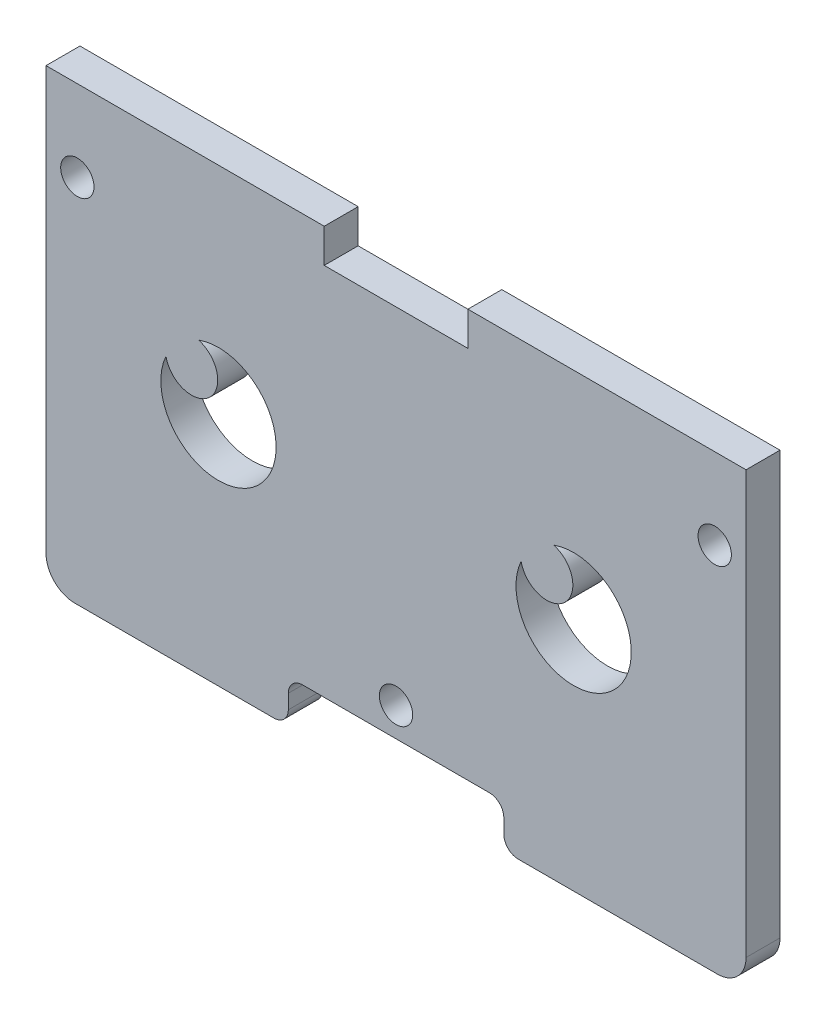
ISO-10303-21;
HEADER;
FILE_DESCRIPTION(('STEP AP214'),'2;1');
FILE_NAME('part.step','',(''),(''),'','','');
FILE_SCHEMA(('AUTOMOTIVE_DESIGN { 1 0 10303 214 1 1 1 1 }'));
ENDSEC;
DATA;
#1=APPLICATION_CONTEXT('core data for automotive mechanical design processes');
#2=APPLICATION_PROTOCOL_DEFINITION('international standard','automotive_design',2000,#1);
#3=PRODUCT_CONTEXT('',#1,'mechanical');
#4=PRODUCT('Part','Part','',(#3));
#5=PRODUCT_RELATED_PRODUCT_CATEGORY('part','',(#4));
#6=PRODUCT_DEFINITION_FORMATION('','',#4);
#7=PRODUCT_DEFINITION_CONTEXT('part definition',#1,'design');
#8=PRODUCT_DEFINITION('design','',#6,#7);
#9=PRODUCT_DEFINITION_SHAPE('','',#8);
#10=(LENGTH_UNIT() NAMED_UNIT(*) SI_UNIT(.MILLI.,.METRE.));
#11=(NAMED_UNIT(*) PLANE_ANGLE_UNIT() SI_UNIT($,.RADIAN.));
#12=(NAMED_UNIT(*) SI_UNIT($,.STERADIAN.) SOLID_ANGLE_UNIT());
#13=UNCERTAINTY_MEASURE_WITH_UNIT(LENGTH_MEASURE(1.E-05),#10,'distance_accuracy_value','');
#14=(GEOMETRIC_REPRESENTATION_CONTEXT(3) GLOBAL_UNCERTAINTY_ASSIGNED_CONTEXT((#13)) GLOBAL_UNIT_ASSIGNED_CONTEXT((#10,
#11,#12)) REPRESENTATION_CONTEXT('',''));
#15=CARTESIAN_POINT('',(0.,0.,0.));
#16=DIRECTION('',(0.,0.,1.));
#17=DIRECTION('',(1.,0.,0.));
#18=AXIS2_PLACEMENT_3D('',#15,#16,#17);
#19=CARTESIAN_POINT('',(0.,0.,3.));
#20=DIRECTION('',(0.,1.,0.));
#21=DIRECTION('',(0.,0.,1.));
#22=AXIS2_PLACEMENT_3D('',#19,#20,#21);
#23=PLANE('',#22);
#24=DIRECTION('',(1.,0.,0.));
#25=VECTOR('',#24,1.);
#26=CARTESIAN_POINT('',(0.,0.,3.));
#27=LINE('',#26,#25);
#28=CARTESIAN_POINT('',(41.7378,0.,3.));
#29=VERTEX_POINT('',#28);
#30=CARTESIAN_POINT('',(59.34,0.,3.));
#31=VERTEX_POINT('',#30);
#32=EDGE_CURVE('E281',#29,#31,#27,.T.);
#33=ORIENTED_EDGE('',*,*,#32,.F.);
#34=DIRECTION('',(0.,0.,-1.));
#35=VECTOR('',#34,1.);
#36=CARTESIAN_POINT('',(41.7378,0.,3.));
#37=LINE('',#36,#35);
#38=CARTESIAN_POINT('',(41.7378,0.,0.));
#39=VERTEX_POINT('',#38);
#40=EDGE_CURVE('E354',#29,#39,#37,.T.);
#41=ORIENTED_EDGE('',*,*,#40,.T.);
#42=DIRECTION('',(1.,0.,0.));
#43=VECTOR('',#42,1.);
#44=CARTESIAN_POINT('',(0.,0.,0.));
#45=LINE('',#44,#43);
#46=CARTESIAN_POINT('',(59.34,0.,0.));
#47=VERTEX_POINT('',#46);
#48=EDGE_CURVE('E295',#39,#47,#45,.T.);
#49=ORIENTED_EDGE('',*,*,#48,.T.);
#50=DIRECTION('',(0.,0.,-1.));
#51=VECTOR('',#50,1.);
#52=CARTESIAN_POINT('',(59.34,0.,3.));
#53=LINE('',#52,#51);
#54=EDGE_CURVE('E309',#47,#31,#53,.F.);
#55=ORIENTED_EDGE('',*,*,#54,.T.);
#56=EDGE_LOOP('',(#33,#41,#49,#55));
#57=FACE_BOUND('',#56,.T.);
#58=ADVANCED_FACE('F34',(#57),#23,.F.);
#59=CARTESIAN_POINT('',(0.,39.878,3.));
#60=DIRECTION('',(0.,-1.,0.));
#61=DIRECTION('',(0.,0.,-1.));
#62=AXIS2_PLACEMENT_3D('',#59,#60,#61);
#63=PLANE('',#62);
#64=DIRECTION('',(-1.,0.,0.));
#65=VECTOR('',#64,1.);
#66=CARTESIAN_POINT('',(0.,39.878,0.));
#67=LINE('',#66,#65);
#68=CARTESIAN_POINT('',(61.88,39.878,0.));
#69=VERTEX_POINT('',#68);
#70=CARTESIAN_POINT('',(37.2928,39.878,0.));
#71=VERTEX_POINT('',#70);
#72=EDGE_CURVE('E282',#69,#71,#67,.T.);
#73=ORIENTED_EDGE('',*,*,#72,.T.);
#74=DIRECTION('',(0.,0.,-1.));
#75=VECTOR('',#74,1.);
#76=CARTESIAN_POINT('',(37.2928,39.878,3.));
#77=LINE('',#76,#75);
#78=CARTESIAN_POINT('',(37.2928,39.878,3.));
#79=VERTEX_POINT('',#78);
#80=EDGE_CURVE('E250',#79,#71,#77,.T.);
#81=ORIENTED_EDGE('',*,*,#80,.F.);
#82=DIRECTION('',(-1.,0.,0.));
#83=VECTOR('',#82,1.);
#84=CARTESIAN_POINT('',(0.,39.878,3.));
#85=LINE('',#84,#83);
#86=CARTESIAN_POINT('',(61.88,39.878,3.));
#87=VERTEX_POINT('',#86);
#88=EDGE_CURVE('E289',#87,#79,#85,.T.);
#89=ORIENTED_EDGE('',*,*,#88,.F.);
#90=DIRECTION('',(0.,0.,-1.));
#91=VECTOR('',#90,1.);
#92=CARTESIAN_POINT('',(61.88,39.878,3.));
#93=LINE('',#92,#91);
#94=EDGE_CURVE('E306',#87,#69,#93,.T.);
#95=ORIENTED_EDGE('',*,*,#94,.T.);
#96=EDGE_LOOP('',(#73,#81,#89,#95));
#97=FACE_BOUND('',#96,.T.);
#98=ADVANCED_FACE('F401',(#97),#63,.F.);
#99=CARTESIAN_POINT('',(0.,0.,3.));
#100=DIRECTION('',(1.,0.,0.));
#101=DIRECTION('',(0.,1.,0.));
#102=AXIS2_PLACEMENT_3D('',#99,#100,#101);
#103=PLANE('',#102);
#104=DIRECTION('',(0.,-1.,0.));
#105=VECTOR('',#104,1.);
#106=CARTESIAN_POINT('',(0.,0.,0.));
#107=LINE('',#106,#105);
#108=CARTESIAN_POINT('',(0.,39.878,0.));
#109=VERTEX_POINT('',#108);
#110=CARTESIAN_POINT('',(0.,2.54,0.));
#111=VERTEX_POINT('',#110);
#112=EDGE_CURVE('E277',#109,#111,#107,.T.);
#113=ORIENTED_EDGE('',*,*,#112,.T.);
#114=DIRECTION('',(0.,0.,-1.));
#115=VECTOR('',#114,1.);
#116=CARTESIAN_POINT('',(0.,2.54,3.));
#117=LINE('',#116,#115);
#118=CARTESIAN_POINT('',(0.,2.54,3.));
#119=VERTEX_POINT('',#118);
#120=EDGE_CURVE('E320',#111,#119,#117,.F.);
#121=ORIENTED_EDGE('',*,*,#120,.T.);
#122=DIRECTION('',(0.,-1.,0.));
#123=VECTOR('',#122,1.);
#124=CARTESIAN_POINT('',(0.,0.,3.));
#125=LINE('',#124,#123);
#126=CARTESIAN_POINT('',(0.,39.878,3.));
#127=VERTEX_POINT('',#126);
#128=EDGE_CURVE('E278',#127,#119,#125,.T.);
#129=ORIENTED_EDGE('',*,*,#128,.F.);
#130=DIRECTION('',(0.,0.,-1.));
#131=VECTOR('',#130,1.);
#132=CARTESIAN_POINT('',(0.,39.878,3.));
#133=LINE('',#132,#131);
#134=EDGE_CURVE('E292',#127,#109,#133,.T.);
#135=ORIENTED_EDGE('',*,*,#134,.T.);
#136=EDGE_LOOP('',(#113,#121,#129,#135));
#137=FACE_BOUND('',#136,.T.);
#138=ADVANCED_FACE('F421',(#137),#103,.F.);
#139=CARTESIAN_POINT('',(2.54,0.,0.));
#140=VERTEX_POINT('',#139);
#141=CARTESIAN_POINT('',(20.1478,0.,0.));
#142=VERTEX_POINT('',#141);
#143=EDGE_CURVE('E296',#140,#142,#45,.T.);
#144=ORIENTED_EDGE('',*,*,#143,.T.);
#145=DIRECTION('',(0.,0.,-1.));
#146=VECTOR('',#145,1.);
#147=CARTESIAN_POINT('',(20.1478,0.,3.));
#148=LINE('',#147,#146);
#149=CARTESIAN_POINT('',(20.1478,0.,3.));
#150=VERTEX_POINT('',#149);
#151=EDGE_CURVE('E348',#142,#150,#148,.F.);
#152=ORIENTED_EDGE('',*,*,#151,.T.);
#153=CARTESIAN_POINT('',(2.54,0.,3.));
#154=VERTEX_POINT('',#153);
#155=EDGE_CURVE('E283',#154,#150,#27,.T.);
#156=ORIENTED_EDGE('',*,*,#155,.F.);
#157=DIRECTION('',(0.,0.,-1.));
#158=VECTOR('',#157,1.);
#159=CARTESIAN_POINT('',(2.54,0.,3.));
#160=LINE('',#159,#158);
#161=EDGE_CURVE('E312',#154,#140,#160,.T.);
#162=ORIENTED_EDGE('',*,*,#161,.T.);
#163=EDGE_LOOP('',(#144,#152,#156,#162));
#164=FACE_BOUND('',#163,.T.);
#165=ADVANCED_FACE('F430',(#164),#23,.F.);
#166=CARTESIAN_POINT('',(61.88,0.,3.));
#167=DIRECTION('',(-1.,0.,0.));
#168=DIRECTION('',(0.,-1.,0.));
#169=AXIS2_PLACEMENT_3D('',#166,#167,#168);
#170=PLANE('',#169);
#171=DIRECTION('',(0.,1.,0.));
#172=VECTOR('',#171,1.);
#173=CARTESIAN_POINT('',(61.88,0.,3.));
#174=LINE('',#173,#172);
#175=CARTESIAN_POINT('',(61.88,2.54,3.));
#176=VERTEX_POINT('',#175);
#177=EDGE_CURVE('E286',#176,#87,#174,.T.);
#178=ORIENTED_EDGE('',*,*,#177,.F.);
#179=DIRECTION('',(0.,0.,-1.));
#180=VECTOR('',#179,1.);
#181=CARTESIAN_POINT('',(61.88,2.54,3.));
#182=LINE('',#181,#180);
#183=CARTESIAN_POINT('',(61.88,2.54,0.));
#184=VERTEX_POINT('',#183);
#185=EDGE_CURVE('E326',#176,#184,#182,.T.);
#186=ORIENTED_EDGE('',*,*,#185,.T.);
#187=DIRECTION('',(0.,1.,0.));
#188=VECTOR('',#187,1.);
#189=CARTESIAN_POINT('',(61.88,0.,0.));
#190=LINE('',#189,#188);
#191=EDGE_CURVE('E299',#184,#69,#190,.T.);
#192=ORIENTED_EDGE('',*,*,#191,.T.);
#193=ORIENTED_EDGE('',*,*,#94,.F.);
#194=EDGE_LOOP('',(#178,#186,#192,#193));
#195=FACE_BOUND('',#194,.T.);
#196=ADVANCED_FACE('F395',(#195),#170,.F.);
#197=CARTESIAN_POINT('',(24.5928,39.878,3.));
#198=VERTEX_POINT('',#197);
#199=EDGE_CURVE('E288',#198,#127,#85,.T.);
#200=ORIENTED_EDGE('',*,*,#199,.F.);
#201=DIRECTION('',(0.,0.,-1.));
#202=VECTOR('',#201,1.);
#203=CARTESIAN_POINT('',(24.5928,39.878,3.));
#204=LINE('',#203,#202);
#205=CARTESIAN_POINT('',(24.5928,39.878,0.));
#206=VERTEX_POINT('',#205);
#207=EDGE_CURVE('E253',#198,#206,#204,.T.);
#208=ORIENTED_EDGE('',*,*,#207,.T.);
#209=EDGE_CURVE('E301',#206,#109,#67,.T.);
#210=ORIENTED_EDGE('',*,*,#209,.T.);
#211=ORIENTED_EDGE('',*,*,#134,.F.);
#212=EDGE_LOOP('',(#200,#208,#210,#211));
#213=FACE_BOUND('',#212,.T.);
#214=ADVANCED_FACE('F416',(#213),#63,.F.);
#215=CARTESIAN_POINT('',(0.,0.,3.));
#216=DIRECTION('',(0.,0.,-1.));
#217=DIRECTION('',(-1.,0.,0.));
#218=AXIS2_PLACEMENT_3D('',#215,#216,#217);
#219=PLANE('',#218);
#220=CARTESIAN_POINT('',(15.2456,20.828,3.));
#221=DIRECTION('',(0.,0.,-1.));
#222=DIRECTION('',(1.,0.,0.));
#223=AXIS2_PLACEMENT_3D('',#220,#221,#222);
#224=CIRCLE('',#223,5.09547608189994);
#225=CARTESIAN_POINT('',(13.4861980661664,25.6100896411963,3.));
#226=VERTEX_POINT('',#225);
#227=CARTESIAN_POINT('',(10.6042719797585,22.930843481987,3.));
#228=VERTEX_POINT('',#227);
#229=EDGE_CURVE('E185',#226,#228,#224,.T.);
#230=ORIENTED_EDGE('',*,*,#229,.T.);
#231=CARTESIAN_POINT('',(12.867613184447,23.3858770406445,3.));
#232=DIRECTION('',(0.,0.,1.));
#233=DIRECTION('',(1.,0.,0.));
#234=AXIS2_PLACEMENT_3D('',#231,#232,#233);
#235=CIRCLE('',#234,2.30862923579023);
#236=EDGE_CURVE('E49',#228,#226,#235,.T.);
#237=ORIENTED_EDGE('',*,*,#236,.T.);
#238=EDGE_LOOP('',(#230,#237));
#239=FACE_BOUND('',#238,.T.);
#240=CARTESIAN_POINT('',(44.262013184447,23.3858770406445,3.));
#241=DIRECTION('',(0.,0.,1.));
#242=DIRECTION('',(1.,0.,0.));
#243=AXIS2_PLACEMENT_3D('',#240,#241,#242);
#244=CIRCLE('',#243,2.30862923579023);
#245=CARTESIAN_POINT('',(41.9986719797585,22.930843481987,3.));
#246=VERTEX_POINT('',#245);
#247=CARTESIAN_POINT('',(44.8805980661664,25.6100896411963,3.));
#248=VERTEX_POINT('',#247);
#249=EDGE_CURVE('E203',#246,#248,#244,.T.);
#250=ORIENTED_EDGE('',*,*,#249,.T.);
#251=CARTESIAN_POINT('',(46.64,20.828,3.));
#252=DIRECTION('',(0.,0.,-1.));
#253=DIRECTION('',(1.,0.,0.));
#254=AXIS2_PLACEMENT_3D('',#251,#252,#253);
#255=CIRCLE('',#254,5.09547608189994);
#256=EDGE_CURVE('E200',#248,#246,#255,.T.);
#257=ORIENTED_EDGE('',*,*,#256,.T.);
#258=EDGE_LOOP('',(#250,#257));
#259=FACE_BOUND('',#258,.T.);
#260=ORIENTED_EDGE('',*,*,#155,.T.);
#261=CARTESIAN_POINT('',(20.1478,1.27,3.));
#262=DIRECTION('',(0.,0.,-1.));
#263=DIRECTION('',(-1.,0.,0.));
#264=AXIS2_PLACEMENT_3D('',#261,#262,#263);
#265=CIRCLE('',#264,1.27);
#266=CARTESIAN_POINT('',(21.4178,1.27,3.));
#267=VERTEX_POINT('',#266);
#268=EDGE_CURVE('E352',#150,#267,#265,.F.);
#269=ORIENTED_EDGE('',*,*,#268,.T.);
#270=DIRECTION('',(0.,1.,0.));
#271=VECTOR('',#270,1.);
#272=CARTESIAN_POINT('',(21.4178,0.,3.));
#273=LINE('',#272,#271);
#274=CARTESIAN_POINT('',(21.4178,2.54,3.));
#275=VERTEX_POINT('',#274);
#276=EDGE_CURVE('E219',#267,#275,#273,.T.);
#277=ORIENTED_EDGE('',*,*,#276,.T.);
#278=CARTESIAN_POINT('',(22.6878,2.54,3.));
#279=DIRECTION('',(0.,0.,-1.));
#280=DIRECTION('',(-1.,0.,0.));
#281=AXIS2_PLACEMENT_3D('',#278,#279,#280);
#282=CIRCLE('',#281,1.27);
#283=CARTESIAN_POINT('',(22.6878,3.81,3.));
#284=VERTEX_POINT('',#283);
#285=EDGE_CURVE('E359',#275,#284,#282,.T.);
#286=ORIENTED_EDGE('',*,*,#285,.T.);
#287=DIRECTION('',(1.,0.,0.));
#288=VECTOR('',#287,1.);
#289=CARTESIAN_POINT('',(40.4678,3.81,3.));
#290=LINE('',#289,#288);
#291=CARTESIAN_POINT('',(39.1978,3.81,3.));
#292=VERTEX_POINT('',#291);
#293=EDGE_CURVE('E223',#284,#292,#290,.T.);
#294=ORIENTED_EDGE('',*,*,#293,.T.);
#295=CARTESIAN_POINT('',(39.1978,2.54,3.));
#296=DIRECTION('',(0.,0.,-1.));
#297=DIRECTION('',(-1.,0.,0.));
#298=AXIS2_PLACEMENT_3D('',#295,#296,#297);
#299=CIRCLE('',#298,1.27);
#300=CARTESIAN_POINT('',(40.4678,2.54,3.));
#301=VERTEX_POINT('',#300);
#302=EDGE_CURVE('E11',#292,#301,#299,.T.);
#303=ORIENTED_EDGE('',*,*,#302,.T.);
#304=DIRECTION('',(0.,-1.,0.));
#305=VECTOR('',#304,1.);
#306=CARTESIAN_POINT('',(40.4678,0.,3.));
#307=LINE('',#306,#305);
#308=CARTESIAN_POINT('',(40.4678,1.27,3.));
#309=VERTEX_POINT('',#308);
#310=EDGE_CURVE('E216',#301,#309,#307,.T.);
#311=ORIENTED_EDGE('',*,*,#310,.T.);
#312=CARTESIAN_POINT('',(41.7378,1.27,3.));
#313=DIRECTION('',(0.,0.,-1.));
#314=DIRECTION('',(-1.,0.,0.));
#315=AXIS2_PLACEMENT_3D('',#312,#313,#314);
#316=CIRCLE('',#315,1.27);
#317=EDGE_CURVE('E350',#309,#29,#316,.F.);
#318=ORIENTED_EDGE('',*,*,#317,.T.);
#319=ORIENTED_EDGE('',*,*,#32,.T.);
#320=CARTESIAN_POINT('',(59.34,2.54,3.));
#321=DIRECTION('',(0.,0.,-1.));
#322=DIRECTION('',(-1.,0.,0.));
#323=AXIS2_PLACEMENT_3D('',#320,#321,#322);
#324=CIRCLE('',#323,2.54);
#325=EDGE_CURVE('E322',#31,#176,#324,.F.);
#326=ORIENTED_EDGE('',*,*,#325,.T.);
#327=ORIENTED_EDGE('',*,*,#177,.T.);
#328=ORIENTED_EDGE('',*,*,#88,.T.);
#329=DIRECTION('',(0.,-1.,0.));
#330=VECTOR('',#329,1.);
#331=CARTESIAN_POINT('',(37.2928,39.878,3.));
#332=LINE('',#331,#330);
#333=CARTESIAN_POINT('',(37.2928,36.878,3.));
#334=VERTEX_POINT('',#333);
#335=EDGE_CURVE('E234',#79,#334,#332,.T.);
#336=ORIENTED_EDGE('',*,*,#335,.T.);
#337=DIRECTION('',(-1.,0.,0.));
#338=VECTOR('',#337,1.);
#339=CARTESIAN_POINT('',(37.2928,36.878,3.));
#340=LINE('',#339,#338);
#341=CARTESIAN_POINT('',(24.5928,36.878,3.));
#342=VERTEX_POINT('',#341);
#343=EDGE_CURVE('E237',#334,#342,#340,.T.);
#344=ORIENTED_EDGE('',*,*,#343,.T.);
#345=DIRECTION('',(0.,1.,0.));
#346=VECTOR('',#345,1.);
#347=CARTESIAN_POINT('',(24.5928,39.878,3.));
#348=LINE('',#347,#346);
#349=EDGE_CURVE('E241',#342,#198,#348,.T.);
#350=ORIENTED_EDGE('',*,*,#349,.T.);
#351=ORIENTED_EDGE('',*,*,#199,.T.);
#352=ORIENTED_EDGE('',*,*,#128,.T.);
#353=CARTESIAN_POINT('',(2.54,2.54,3.));
#354=DIRECTION('',(0.,0.,-1.));
#355=DIRECTION('',(-1.,0.,0.));
#356=AXIS2_PLACEMENT_3D('',#353,#354,#355);
#357=CIRCLE('',#356,2.54);
#358=EDGE_CURVE('E324',#119,#154,#357,.F.);
#359=ORIENTED_EDGE('',*,*,#358,.T.);
#360=EDGE_LOOP('',(#260,#269,#277,#286,#294,#303,#311,#318,#319,#326,#327,#328,#336,#344,#350,
#351,#352,#359));
#361=FACE_BOUND('',#360,.T.);
#362=CARTESIAN_POINT('',(30.94,6.373999952,3.));
#363=DIRECTION('',(0.,0.,1.));
#364=DIRECTION('',(1.,0.,0.));
#365=AXIS2_PLACEMENT_3D('',#362,#363,#364);
#366=CIRCLE('',#365,1.47319999999998);
#367=CARTESIAN_POINT('',(32.4132,6.373999952,3.));
#368=VERTEX_POINT('',#367);
#369=EDGE_CURVE('E252',#368,#368,#366,.T.);
#370=ORIENTED_EDGE('',*,*,#369,.F.);
#371=EDGE_LOOP('',(#370));
#372=FACE_BOUND('',#371,.T.);
#373=CARTESIAN_POINT('',(59.11,32.7152,3.));
#374=DIRECTION('',(0.,0.,1.));
#375=DIRECTION('',(1.,0.,0.));
#376=AXIS2_PLACEMENT_3D('',#373,#374,#375);
#377=CIRCLE('',#376,1.47319999999999);
#378=CARTESIAN_POINT('',(60.5832,32.7152,3.));
#379=VERTEX_POINT('',#378);
#380=EDGE_CURVE('E265',#379,#379,#377,.T.);
#381=ORIENTED_EDGE('',*,*,#380,.F.);
#382=EDGE_LOOP('',(#381));
#383=FACE_BOUND('',#382,.T.);
#384=CARTESIAN_POINT('',(2.76999999999999,32.7152,3.));
#385=DIRECTION('',(0.,0.,1.));
#386=DIRECTION('',(1.,0.,0.));
#387=AXIS2_PLACEMENT_3D('',#384,#385,#386);
#388=CIRCLE('',#387,1.47319999999999);
#389=CARTESIAN_POINT('',(4.24319999999998,32.7152,3.));
#390=VERTEX_POINT('',#389);
#391=EDGE_CURVE('E271',#390,#390,#388,.T.);
#392=ORIENTED_EDGE('',*,*,#391,.F.);
#393=EDGE_LOOP('',(#392));
#394=FACE_BOUND('',#393,.T.);
#395=ADVANCED_FACE('F191',(#239,#259,#361,#372,#383,#394),#219,.F.);
#396=CARTESIAN_POINT('',(0.,0.,0.));
#397=DIRECTION('',(0.,0.,-1.));
#398=DIRECTION('',(-1.,0.,0.));
#399=AXIS2_PLACEMENT_3D('',#396,#397,#398);
#400=PLANE('',#399);
#401=CARTESIAN_POINT('',(12.867613184447,23.3858770406445,0.));
#402=DIRECTION('',(0.,0.,1.));
#403=DIRECTION('',(1.,0.,0.));
#404=AXIS2_PLACEMENT_3D('',#401,#402,#403);
#405=CIRCLE('',#404,2.30862923579023);
#406=CARTESIAN_POINT('',(10.6042719797585,22.930843481987,0.));
#407=VERTEX_POINT('',#406);
#408=CARTESIAN_POINT('',(13.4861980661664,25.6100896411963,0.));
#409=VERTEX_POINT('',#408);
#410=EDGE_CURVE('E54',#407,#409,#405,.T.);
#411=ORIENTED_EDGE('',*,*,#410,.F.);
#412=CARTESIAN_POINT('',(15.2456,20.828,0.));
#413=DIRECTION('',(0.,0.,-1.));
#414=DIRECTION('',(1.,0.,0.));
#415=AXIS2_PLACEMENT_3D('',#412,#413,#414);
#416=CIRCLE('',#415,5.09547608189994);
#417=EDGE_CURVE('E193',#409,#407,#416,.T.);
#418=ORIENTED_EDGE('',*,*,#417,.F.);
#419=EDGE_LOOP('',(#411,#418));
#420=FACE_BOUND('',#419,.T.);
#421=CARTESIAN_POINT('',(46.64,20.828,0.));
#422=DIRECTION('',(0.,0.,-1.));
#423=DIRECTION('',(1.,0.,0.));
#424=AXIS2_PLACEMENT_3D('',#421,#422,#423);
#425=CIRCLE('',#424,5.09547608189994);
#426=CARTESIAN_POINT('',(44.8805980661664,25.6100896411963,0.));
#427=VERTEX_POINT('',#426);
#428=CARTESIAN_POINT('',(41.9986719797585,22.930843481987,0.));
#429=VERTEX_POINT('',#428);
#430=EDGE_CURVE('E198',#427,#429,#425,.T.);
#431=ORIENTED_EDGE('',*,*,#430,.F.);
#432=CARTESIAN_POINT('',(44.262013184447,23.3858770406445,0.));
#433=DIRECTION('',(0.,0.,1.));
#434=DIRECTION('',(1.,0.,0.));
#435=AXIS2_PLACEMENT_3D('',#432,#433,#434);
#436=CIRCLE('',#435,2.30862923579023);
#437=EDGE_CURVE('E204',#429,#427,#436,.T.);
#438=ORIENTED_EDGE('',*,*,#437,.F.);
#439=EDGE_LOOP('',(#431,#438));
#440=FACE_BOUND('',#439,.T.);
#441=DIRECTION('',(0.,1.,0.));
#442=VECTOR('',#441,1.);
#443=CARTESIAN_POINT('',(21.4178,0.,0.));
#444=LINE('',#443,#442);
#445=CARTESIAN_POINT('',(21.4178,1.27,0.));
#446=VERTEX_POINT('',#445);
#447=CARTESIAN_POINT('',(21.4178,2.54,0.));
#448=VERTEX_POINT('',#447);
#449=EDGE_CURVE('E229',#446,#448,#444,.T.);
#450=ORIENTED_EDGE('',*,*,#449,.F.);
#451=CARTESIAN_POINT('',(20.1478,1.27,0.));
#452=DIRECTION('',(0.,0.,-1.));
#453=DIRECTION('',(-1.,0.,0.));
#454=AXIS2_PLACEMENT_3D('',#451,#452,#453);
#455=CIRCLE('',#454,1.27);
#456=EDGE_CURVE('E346',#446,#142,#455,.T.);
#457=ORIENTED_EDGE('',*,*,#456,.T.);
#458=ORIENTED_EDGE('',*,*,#143,.F.);
#459=CARTESIAN_POINT('',(2.54,2.54,0.));
#460=DIRECTION('',(0.,0.,-1.));
#461=DIRECTION('',(-1.,0.,0.));
#462=AXIS2_PLACEMENT_3D('',#459,#460,#461);
#463=CIRCLE('',#462,2.54);
#464=EDGE_CURVE('E318',#140,#111,#463,.T.);
#465=ORIENTED_EDGE('',*,*,#464,.T.);
#466=ORIENTED_EDGE('',*,*,#112,.F.);
#467=ORIENTED_EDGE('',*,*,#209,.F.);
#468=DIRECTION('',(0.,1.,0.));
#469=VECTOR('',#468,1.);
#470=CARTESIAN_POINT('',(24.5928,39.878,0.));
#471=LINE('',#470,#469);
#472=CARTESIAN_POINT('',(24.5928,36.878,0.));
#473=VERTEX_POINT('',#472);
#474=EDGE_CURVE('E238',#473,#206,#471,.T.);
#475=ORIENTED_EDGE('',*,*,#474,.F.);
#476=DIRECTION('',(-1.,0.,0.));
#477=VECTOR('',#476,1.);
#478=CARTESIAN_POINT('',(37.2928,36.878,0.));
#479=LINE('',#478,#477);
#480=CARTESIAN_POINT('',(37.2928,36.878,0.));
#481=VERTEX_POINT('',#480);
#482=EDGE_CURVE('E246',#481,#473,#479,.T.);
#483=ORIENTED_EDGE('',*,*,#482,.F.);
#484=DIRECTION('',(0.,-1.,0.));
#485=VECTOR('',#484,1.);
#486=CARTESIAN_POINT('',(37.2928,39.878,0.));
#487=LINE('',#486,#485);
#488=EDGE_CURVE('E226',#71,#481,#487,.T.);
#489=ORIENTED_EDGE('',*,*,#488,.F.);
#490=ORIENTED_EDGE('',*,*,#72,.F.);
#491=ORIENTED_EDGE('',*,*,#191,.F.);
#492=CARTESIAN_POINT('',(59.34,2.54,0.));
#493=DIRECTION('',(0.,0.,-1.));
#494=DIRECTION('',(-1.,0.,0.));
#495=AXIS2_PLACEMENT_3D('',#492,#493,#494);
#496=CIRCLE('',#495,2.54);
#497=EDGE_CURVE('E315',#184,#47,#496,.T.);
#498=ORIENTED_EDGE('',*,*,#497,.T.);
#499=ORIENTED_EDGE('',*,*,#48,.F.);
#500=CARTESIAN_POINT('',(41.7378,1.27,0.));
#501=DIRECTION('',(0.,0.,-1.));
#502=DIRECTION('',(-1.,0.,0.));
#503=AXIS2_PLACEMENT_3D('',#500,#501,#502);
#504=CIRCLE('',#503,1.27);
#505=CARTESIAN_POINT('',(40.4678,1.27,0.));
#506=VERTEX_POINT('',#505);
#507=EDGE_CURVE('E344',#39,#506,#504,.T.);
#508=ORIENTED_EDGE('',*,*,#507,.T.);
#509=DIRECTION('',(0.,-1.,0.));
#510=VECTOR('',#509,1.);
#511=CARTESIAN_POINT('',(40.4678,0.,0.));
#512=LINE('',#511,#510);
#513=CARTESIAN_POINT('',(40.4678,2.54,0.));
#514=VERTEX_POINT('',#513);
#515=EDGE_CURVE('E213',#514,#506,#512,.T.);
#516=ORIENTED_EDGE('',*,*,#515,.F.);
#517=CARTESIAN_POINT('',(39.1978,2.54,0.));
#518=DIRECTION('',(0.,0.,-1.));
#519=DIRECTION('',(-1.,0.,0.));
#520=AXIS2_PLACEMENT_3D('',#517,#518,#519);
#521=CIRCLE('',#520,1.27);
#522=CARTESIAN_POINT('',(39.1978,3.81,0.));
#523=VERTEX_POINT('',#522);
#524=EDGE_CURVE('E42',#514,#523,#521,.F.);
#525=ORIENTED_EDGE('',*,*,#524,.T.);
#526=DIRECTION('',(1.,0.,0.));
#527=VECTOR('',#526,1.);
#528=CARTESIAN_POINT('',(40.4678,3.81,0.));
#529=LINE('',#528,#527);
#530=CARTESIAN_POINT('',(22.6878,3.81,0.));
#531=VERTEX_POINT('',#530);
#532=EDGE_CURVE('E220',#531,#523,#529,.T.);
#533=ORIENTED_EDGE('',*,*,#532,.F.);
#534=CARTESIAN_POINT('',(22.6878,2.54,0.));
#535=DIRECTION('',(0.,0.,-1.));
#536=DIRECTION('',(-1.,0.,0.));
#537=AXIS2_PLACEMENT_3D('',#534,#535,#536);
#538=CIRCLE('',#537,1.27);
#539=EDGE_CURVE('E357',#531,#448,#538,.F.);
#540=ORIENTED_EDGE('',*,*,#539,.T.);
#541=EDGE_LOOP('',(#450,#457,#458,#465,#466,#467,#475,#483,#489,#490,#491,#498,#499,#508,#516,
#525,#533,#540));
#542=FACE_BOUND('',#541,.T.);
#543=CARTESIAN_POINT('',(30.94,6.373999952,0.));
#544=DIRECTION('',(0.,0.,1.));
#545=DIRECTION('',(1.,0.,0.));
#546=AXIS2_PLACEMENT_3D('',#543,#544,#545);
#547=CIRCLE('',#546,1.4732);
#548=CARTESIAN_POINT('',(32.4132,6.373999952,0.));
#549=VERTEX_POINT('',#548);
#550=EDGE_CURVE('E262',#549,#549,#547,.T.);
#551=ORIENTED_EDGE('',*,*,#550,.T.);
#552=EDGE_LOOP('',(#551));
#553=FACE_BOUND('',#552,.T.);
#554=CARTESIAN_POINT('',(59.11,32.7152,0.));
#555=DIRECTION('',(0.,0.,1.));
#556=DIRECTION('',(1.,0.,0.));
#557=AXIS2_PLACEMENT_3D('',#554,#555,#556);
#558=CIRCLE('',#557,1.4732);
#559=CARTESIAN_POINT('',(60.5832,32.7152,0.));
#560=VERTEX_POINT('',#559);
#561=EDGE_CURVE('E268',#560,#560,#558,.T.);
#562=ORIENTED_EDGE('',*,*,#561,.T.);
#563=EDGE_LOOP('',(#562));
#564=FACE_BOUND('',#563,.T.);
#565=CARTESIAN_POINT('',(2.76999999999999,32.7152,0.));
#566=DIRECTION('',(0.,0.,1.));
#567=DIRECTION('',(1.,0.,0.));
#568=AXIS2_PLACEMENT_3D('',#565,#566,#567);
#569=CIRCLE('',#568,1.4732);
#570=CARTESIAN_POINT('',(4.24319999999999,32.7152,0.));
#571=VERTEX_POINT('',#570);
#572=EDGE_CURVE('E274',#571,#571,#569,.T.);
#573=ORIENTED_EDGE('',*,*,#572,.T.);
#574=EDGE_LOOP('',(#573));
#575=FACE_BOUND('',#574,.T.);
#576=ADVANCED_FACE('F364',(#420,#440,#542,#553,#564,#575),#400,.T.);
#577=CARTESIAN_POINT('',(2.76999999999999,32.7152,3.));
#578=DIRECTION('',(0.,0.,1.));
#579=DIRECTION('',(1.,0.,0.));
#580=AXIS2_PLACEMENT_3D('',#577,#578,#579);
#581=CYLINDRICAL_SURFACE('',#580,1.47319999999999);
#582=ORIENTED_EDGE('',*,*,#572,.F.);
#583=EDGE_LOOP('',(#582));
#584=FACE_BOUND('',#583,.T.);
#585=ORIENTED_EDGE('',*,*,#391,.T.);
#586=EDGE_LOOP('',(#585));
#587=FACE_BOUND('',#586,.T.);
#588=ADVANCED_FACE('F487',(#584,#587),#581,.F.);
#589=CARTESIAN_POINT('',(59.11,32.7152,3.));
#590=DIRECTION('',(0.,0.,1.));
#591=DIRECTION('',(1.,0.,0.));
#592=AXIS2_PLACEMENT_3D('',#589,#590,#591);
#593=CYLINDRICAL_SURFACE('',#592,1.47319999999999);
#594=ORIENTED_EDGE('',*,*,#561,.F.);
#595=EDGE_LOOP('',(#594));
#596=FACE_BOUND('',#595,.T.);
#597=ORIENTED_EDGE('',*,*,#380,.T.);
#598=EDGE_LOOP('',(#597));
#599=FACE_BOUND('',#598,.T.);
#600=ADVANCED_FACE('F483',(#596,#599),#593,.F.);
#601=CARTESIAN_POINT('',(30.94,6.373999952,3.));
#602=DIRECTION('',(0.,0.,1.));
#603=DIRECTION('',(1.,0.,0.));
#604=AXIS2_PLACEMENT_3D('',#601,#602,#603);
#605=CYLINDRICAL_SURFACE('',#604,1.47319999999999);
#606=ORIENTED_EDGE('',*,*,#550,.F.);
#607=EDGE_LOOP('',(#606));
#608=FACE_BOUND('',#607,.T.);
#609=ORIENTED_EDGE('',*,*,#369,.T.);
#610=EDGE_LOOP('',(#609));
#611=FACE_BOUND('',#610,.T.);
#612=ADVANCED_FACE('F469',(#608,#611),#605,.F.);
#613=CARTESIAN_POINT('',(2.54,2.54,3.));
#614=DIRECTION('',(0.,0.,-1.));
#615=DIRECTION('',(-1.,0.,0.));
#616=AXIS2_PLACEMENT_3D('',#613,#614,#615);
#617=CYLINDRICAL_SURFACE('',#616,2.54);
#618=ORIENTED_EDGE('',*,*,#358,.F.);
#619=ORIENTED_EDGE('',*,*,#120,.F.);
#620=ORIENTED_EDGE('',*,*,#464,.F.);
#621=ORIENTED_EDGE('',*,*,#161,.F.);
#622=EDGE_LOOP('',(#618,#619,#620,#621));
#623=FACE_BOUND('',#622,.T.);
#624=ADVANCED_FACE('F427',(#623),#617,.T.);
#625=CARTESIAN_POINT('',(59.34,2.54,3.));
#626=DIRECTION('',(0.,0.,-1.));
#627=DIRECTION('',(-1.,0.,0.));
#628=AXIS2_PLACEMENT_3D('',#625,#626,#627);
#629=CYLINDRICAL_SURFACE('',#628,2.54);
#630=ORIENTED_EDGE('',*,*,#325,.F.);
#631=ORIENTED_EDGE('',*,*,#54,.F.);
#632=ORIENTED_EDGE('',*,*,#497,.F.);
#633=ORIENTED_EDGE('',*,*,#185,.F.);
#634=EDGE_LOOP('',(#630,#631,#632,#633));
#635=FACE_BOUND('',#634,.T.);
#636=ADVANCED_FACE('F391',(#635),#629,.T.);
#637=CARTESIAN_POINT('',(37.2928,39.878,3.));
#638=DIRECTION('',(1.,0.,0.));
#639=DIRECTION('',(0.,0.,-1.));
#640=AXIS2_PLACEMENT_3D('',#637,#638,#639);
#641=PLANE('',#640);
#642=ORIENTED_EDGE('',*,*,#488,.T.);
#643=DIRECTION('',(0.,0.,-1.));
#644=VECTOR('',#643,1.);
#645=CARTESIAN_POINT('',(37.2928,36.878,3.));
#646=LINE('',#645,#644);
#647=EDGE_CURVE('E244',#334,#481,#646,.T.);
#648=ORIENTED_EDGE('',*,*,#647,.F.);
#649=ORIENTED_EDGE('',*,*,#335,.F.);
#650=ORIENTED_EDGE('',*,*,#80,.T.);
#651=EDGE_LOOP('',(#642,#648,#649,#650));
#652=FACE_BOUND('',#651,.T.);
#653=ADVANCED_FACE('F404',(#652),#641,.F.);
#654=CARTESIAN_POINT('',(24.5928,39.878,3.));
#655=DIRECTION('',(-1.,0.,0.));
#656=DIRECTION('',(0.,0.,1.));
#657=AXIS2_PLACEMENT_3D('',#654,#655,#656);
#658=PLANE('',#657);
#659=ORIENTED_EDGE('',*,*,#474,.T.);
#660=ORIENTED_EDGE('',*,*,#207,.F.);
#661=ORIENTED_EDGE('',*,*,#349,.F.);
#662=DIRECTION('',(0.,0.,-1.));
#663=VECTOR('',#662,1.);
#664=CARTESIAN_POINT('',(24.5928,36.878,3.));
#665=LINE('',#664,#663);
#666=EDGE_CURVE('E256',#342,#473,#665,.T.);
#667=ORIENTED_EDGE('',*,*,#666,.T.);
#668=EDGE_LOOP('',(#659,#660,#661,#667));
#669=FACE_BOUND('',#668,.T.);
#670=ADVANCED_FACE('F412',(#669),#658,.F.);
#671=CARTESIAN_POINT('',(37.2928,36.878,3.));
#672=DIRECTION('',(0.,-1.,0.));
#673=DIRECTION('',(0.,0.,-1.));
#674=AXIS2_PLACEMENT_3D('',#671,#672,#673);
#675=PLANE('',#674);
#676=ORIENTED_EDGE('',*,*,#482,.T.);
#677=ORIENTED_EDGE('',*,*,#666,.F.);
#678=ORIENTED_EDGE('',*,*,#343,.F.);
#679=ORIENTED_EDGE('',*,*,#647,.T.);
#680=EDGE_LOOP('',(#676,#677,#678,#679));
#681=FACE_BOUND('',#680,.T.);
#682=ADVANCED_FACE('F408',(#681),#675,.F.);
#683=CARTESIAN_POINT('',(40.4678,0.,3.));
#684=DIRECTION('',(1.,0.,0.));
#685=DIRECTION('',(0.,0.,-1.));
#686=AXIS2_PLACEMENT_3D('',#683,#684,#685);
#687=PLANE('',#686);
#688=ORIENTED_EDGE('',*,*,#310,.F.);
#689=DIRECTION('',(0.,0.,-1.));
#690=VECTOR('',#689,1.);
#691=CARTESIAN_POINT('',(40.4678,2.54,0.));
#692=LINE('',#691,#690);
#693=EDGE_CURVE('E341',#301,#514,#692,.T.);
#694=ORIENTED_EDGE('',*,*,#693,.T.);
#695=ORIENTED_EDGE('',*,*,#515,.T.);
#696=DIRECTION('',(0.,0.,-1.));
#697=VECTOR('',#696,1.);
#698=CARTESIAN_POINT('',(40.4678,1.27,3.));
#699=LINE('',#698,#697);
#700=EDGE_CURVE('E339',#506,#309,#699,.F.);
#701=ORIENTED_EDGE('',*,*,#700,.T.);
#702=EDGE_LOOP('',(#688,#694,#695,#701));
#703=FACE_BOUND('',#702,.T.);
#704=ADVANCED_FACE('F380',(#703),#687,.F.);
#705=CARTESIAN_POINT('',(40.4678,3.81,3.));
#706=DIRECTION('',(0.,1.,0.));
#707=DIRECTION('',(0.,0.,1.));
#708=AXIS2_PLACEMENT_3D('',#705,#706,#707);
#709=PLANE('',#708);
#710=ORIENTED_EDGE('',*,*,#293,.F.);
#711=DIRECTION('',(0.,0.,-1.));
#712=VECTOR('',#711,1.);
#713=CARTESIAN_POINT('',(22.6878,3.81,0.));
#714=LINE('',#713,#712);
#715=EDGE_CURVE('E331',#284,#531,#714,.T.);
#716=ORIENTED_EDGE('',*,*,#715,.T.);
#717=ORIENTED_EDGE('',*,*,#532,.T.);
#718=DIRECTION('',(0.,0.,-1.));
#719=VECTOR('',#718,1.);
#720=CARTESIAN_POINT('',(39.1978,3.81,3.));
#721=LINE('',#720,#719);
#722=EDGE_CURVE('E329',#523,#292,#721,.F.);
#723=ORIENTED_EDGE('',*,*,#722,.T.);
#724=EDGE_LOOP('',(#710,#716,#717,#723));
#725=FACE_BOUND('',#724,.T.);
#726=ADVANCED_FACE('F371',(#725),#709,.F.);
#727=CARTESIAN_POINT('',(21.4178,0.,3.));
#728=DIRECTION('',(-1.,0.,0.));
#729=DIRECTION('',(0.,0.,1.));
#730=AXIS2_PLACEMENT_3D('',#727,#728,#729);
#731=PLANE('',#730);
#732=ORIENTED_EDGE('',*,*,#449,.T.);
#733=DIRECTION('',(0.,0.,-1.));
#734=VECTOR('',#733,1.);
#735=CARTESIAN_POINT('',(21.4178,2.54,3.));
#736=LINE('',#735,#734);
#737=EDGE_CURVE('E337',#448,#275,#736,.F.);
#738=ORIENTED_EDGE('',*,*,#737,.T.);
#739=ORIENTED_EDGE('',*,*,#276,.F.);
#740=DIRECTION('',(0.,0.,-1.));
#741=VECTOR('',#740,1.);
#742=CARTESIAN_POINT('',(21.4178,1.27,3.));
#743=LINE('',#742,#741);
#744=EDGE_CURVE('E334',#267,#446,#743,.T.);
#745=ORIENTED_EDGE('',*,*,#744,.T.);
#746=EDGE_LOOP('',(#732,#738,#739,#745));
#747=FACE_BOUND('',#746,.T.);
#748=ADVANCED_FACE('F438',(#747),#731,.F.);
#749=CARTESIAN_POINT('',(22.6878,2.54,3.));
#750=DIRECTION('',(0.,0.,1.));
#751=DIRECTION('',(1.,0.,0.));
#752=AXIS2_PLACEMENT_3D('',#749,#750,#751);
#753=CYLINDRICAL_SURFACE('',#752,1.27);
#754=ORIENTED_EDGE('',*,*,#285,.F.);
#755=ORIENTED_EDGE('',*,*,#737,.F.);
#756=ORIENTED_EDGE('',*,*,#539,.F.);
#757=ORIENTED_EDGE('',*,*,#715,.F.);
#758=EDGE_LOOP('',(#754,#755,#756,#757));
#759=FACE_BOUND('',#758,.T.);
#760=ADVANCED_FACE('F442',(#759),#753,.F.);
#761=CARTESIAN_POINT('',(39.1978,2.54,3.));
#762=DIRECTION('',(0.,0.,1.));
#763=DIRECTION('',(1.,0.,0.));
#764=AXIS2_PLACEMENT_3D('',#761,#762,#763);
#765=CYLINDRICAL_SURFACE('',#764,1.27);
#766=ORIENTED_EDGE('',*,*,#302,.F.);
#767=ORIENTED_EDGE('',*,*,#722,.F.);
#768=ORIENTED_EDGE('',*,*,#524,.F.);
#769=ORIENTED_EDGE('',*,*,#693,.F.);
#770=EDGE_LOOP('',(#766,#767,#768,#769));
#771=FACE_BOUND('',#770,.T.);
#772=ADVANCED_FACE('F374',(#771),#765,.F.);
#773=CARTESIAN_POINT('',(20.1478,1.27,3.));
#774=DIRECTION('',(0.,0.,-1.));
#775=DIRECTION('',(-1.,0.,0.));
#776=AXIS2_PLACEMENT_3D('',#773,#774,#775);
#777=CYLINDRICAL_SURFACE('',#776,1.27);
#778=ORIENTED_EDGE('',*,*,#268,.F.);
#779=ORIENTED_EDGE('',*,*,#151,.F.);
#780=ORIENTED_EDGE('',*,*,#456,.F.);
#781=ORIENTED_EDGE('',*,*,#744,.F.);
#782=EDGE_LOOP('',(#778,#779,#780,#781));
#783=FACE_BOUND('',#782,.T.);
#784=ADVANCED_FACE('F435',(#783),#777,.T.);
#785=CARTESIAN_POINT('',(41.7378,1.27,3.));
#786=DIRECTION('',(0.,0.,-1.));
#787=DIRECTION('',(-1.,0.,0.));
#788=AXIS2_PLACEMENT_3D('',#785,#786,#787);
#789=CYLINDRICAL_SURFACE('',#788,1.27);
#790=ORIENTED_EDGE('',*,*,#317,.F.);
#791=ORIENTED_EDGE('',*,*,#700,.F.);
#792=ORIENTED_EDGE('',*,*,#507,.F.);
#793=ORIENTED_EDGE('',*,*,#40,.F.);
#794=EDGE_LOOP('',(#790,#791,#792,#793));
#795=FACE_BOUND('',#794,.T.);
#796=ADVANCED_FACE('F36',(#795),#789,.T.);
#797=CARTESIAN_POINT('',(46.64,20.828,3.));
#798=DIRECTION('',(0.,0.,-1.));
#799=DIRECTION('',(-1.,0.,0.));
#800=AXIS2_PLACEMENT_3D('',#797,#798,#799);
#801=CYLINDRICAL_SURFACE('',#800,5.09547608189994);
#802=ORIENTED_EDGE('',*,*,#430,.T.);
#803=DIRECTION('',(0.,0.,-1.));
#804=VECTOR('',#803,1.);
#805=CARTESIAN_POINT('',(41.9986719797585,22.930843481987,3.));
#806=LINE('',#805,#804);
#807=EDGE_CURVE('E207',#246,#429,#806,.T.);
#808=ORIENTED_EDGE('',*,*,#807,.F.);
#809=ORIENTED_EDGE('',*,*,#256,.F.);
#810=DIRECTION('',(0.,0.,-1.));
#811=VECTOR('',#810,1.);
#812=CARTESIAN_POINT('',(44.8805980661664,25.6100896411963,3.));
#813=LINE('',#812,#811);
#814=EDGE_CURVE('E211',#248,#427,#813,.T.);
#815=ORIENTED_EDGE('',*,*,#814,.T.);
#816=EDGE_LOOP('',(#802,#808,#809,#815));
#817=FACE_BOUND('',#816,.T.);
#818=ADVANCED_FACE('F601',(#817),#801,.F.);
#819=CARTESIAN_POINT('',(44.262013184447,23.3858770406445,3.));
#820=DIRECTION('',(0.,0.,-1.));
#821=DIRECTION('',(-1.,0.,0.));
#822=AXIS2_PLACEMENT_3D('',#819,#820,#821);
#823=CYLINDRICAL_SURFACE('',#822,2.30862923579023);
#824=ORIENTED_EDGE('',*,*,#437,.T.);
#825=ORIENTED_EDGE('',*,*,#814,.F.);
#826=ORIENTED_EDGE('',*,*,#249,.F.);
#827=ORIENTED_EDGE('',*,*,#807,.T.);
#828=EDGE_LOOP('',(#824,#825,#826,#827));
#829=FACE_BOUND('',#828,.T.);
#830=ADVANCED_FACE('F607',(#829),#823,.T.);
#831=CARTESIAN_POINT('',(12.867613184447,23.3858770406445,3.));
#832=DIRECTION('',(0.,0.,-1.));
#833=DIRECTION('',(-1.,0.,0.));
#834=AXIS2_PLACEMENT_3D('',#831,#832,#833);
#835=CYLINDRICAL_SURFACE('',#834,2.30862923579023);
#836=ORIENTED_EDGE('',*,*,#410,.T.);
#837=DIRECTION('',(0.,0.,-1.));
#838=VECTOR('',#837,1.);
#839=CARTESIAN_POINT('',(13.4861980661664,25.6100896411963,3.));
#840=LINE('',#839,#838);
#841=EDGE_CURVE('E178',#226,#409,#840,.T.);
#842=ORIENTED_EDGE('',*,*,#841,.F.);
#843=ORIENTED_EDGE('',*,*,#236,.F.);
#844=DIRECTION('',(0.,0.,-1.));
#845=VECTOR('',#844,1.);
#846=CARTESIAN_POINT('',(10.6042719797585,22.930843481987,3.));
#847=LINE('',#846,#845);
#848=EDGE_CURVE('E184',#228,#407,#847,.T.);
#849=ORIENTED_EDGE('',*,*,#848,.T.);
#850=EDGE_LOOP('',(#836,#842,#843,#849));
#851=FACE_BOUND('',#850,.T.);
#852=ADVANCED_FACE('F180',(#851),#835,.T.);
#853=CARTESIAN_POINT('',(15.2456,20.828,3.));
#854=DIRECTION('',(0.,0.,-1.));
#855=DIRECTION('',(-1.,0.,0.));
#856=AXIS2_PLACEMENT_3D('',#853,#854,#855);
#857=CYLINDRICAL_SURFACE('',#856,5.09547608189994);
#858=ORIENTED_EDGE('',*,*,#417,.T.);
#859=ORIENTED_EDGE('',*,*,#848,.F.);
#860=ORIENTED_EDGE('',*,*,#229,.F.);
#861=ORIENTED_EDGE('',*,*,#841,.T.);
#862=EDGE_LOOP('',(#858,#859,#860,#861));
#863=FACE_BOUND('',#862,.T.);
#864=ADVANCED_FACE('F188',(#863),#857,.F.);
#865=CLOSED_SHELL('',(#58,#98,#138,#165,#196,#214,#395,#576,#588,#600,#612,#624,#636,#653,#670,
#682,#704,#726,#748,#760,#772,#784,#796,#818,#830,#852,#864));
#866=MANIFOLD_SOLID_BREP('B2',#865);
#867=ADVANCED_BREP_SHAPE_REPRESENTATION('',(#18,#866),#14);
#868=SHAPE_DEFINITION_REPRESENTATION(#9,#867);
ENDSEC;
END-ISO-10303-21;
